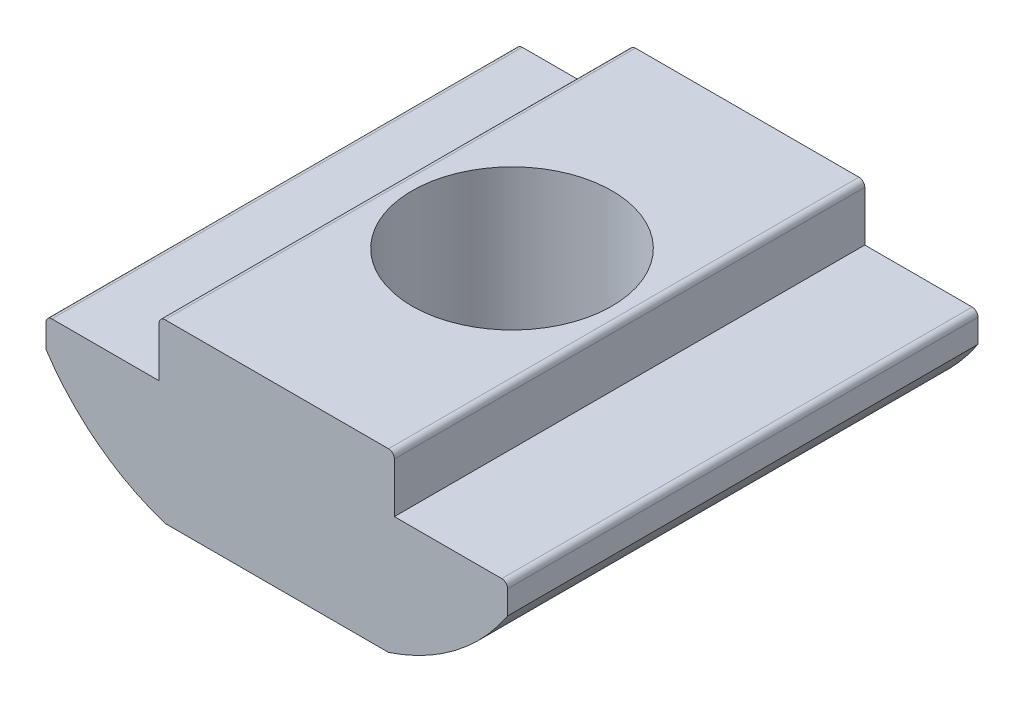
ISO-10303-21;
HEADER;
FILE_DESCRIPTION(('STEP AP214'),'2;1');
FILE_NAME('part.step','',(''),(''),'','','');
FILE_SCHEMA(('AUTOMOTIVE_DESIGN { 1 0 10303 214 1 1 1 1 }'));
ENDSEC;
DATA;
#1=APPLICATION_CONTEXT('core data for automotive mechanical design processes');
#2=APPLICATION_PROTOCOL_DEFINITION('international standard','automotive_design',2000,#1);
#3=PRODUCT_CONTEXT('',#1,'mechanical');
#4=PRODUCT('Part','Part','',(#3));
#5=PRODUCT_RELATED_PRODUCT_CATEGORY('part','',(#4));
#6=PRODUCT_DEFINITION_FORMATION('','',#4);
#7=PRODUCT_DEFINITION_CONTEXT('part definition',#1,'design');
#8=PRODUCT_DEFINITION('design','',#6,#7);
#9=PRODUCT_DEFINITION_SHAPE('','',#8);
#10=(LENGTH_UNIT() NAMED_UNIT(*) SI_UNIT(.MILLI.,.METRE.));
#11=(NAMED_UNIT(*) PLANE_ANGLE_UNIT() SI_UNIT($,.RADIAN.));
#12=(NAMED_UNIT(*) SI_UNIT($,.STERADIAN.) SOLID_ANGLE_UNIT());
#13=UNCERTAINTY_MEASURE_WITH_UNIT(LENGTH_MEASURE(1.E-05),#10,'distance_accuracy_value','');
#14=(GEOMETRIC_REPRESENTATION_CONTEXT(3) GLOBAL_UNCERTAINTY_ASSIGNED_CONTEXT((#13)) GLOBAL_UNIT_ASSIGNED_CONTEXT((#10,
#11,#12)) REPRESENTATION_CONTEXT('',''));
#15=CARTESIAN_POINT('',(0.,0.,0.));
#16=DIRECTION('',(0.,0.,1.));
#17=DIRECTION('',(1.,0.,0.));
#18=AXIS2_PLACEMENT_3D('',#15,#16,#17);
#19=CARTESIAN_POINT('',(1.37998996023953,7.35719053581624,8.));
#20=DIRECTION('',(0.,0.,-1.));
#21=DIRECTION('',(-1.,0.,0.));
#22=AXIS2_PLACEMENT_3D('',#19,#20,#21);
#23=CYLINDRICAL_SURFACE('',#22,7.74497909441023);
#24=CARTESIAN_POINT('',(1.37998996023953,7.35719053581624,-8.));
#25=DIRECTION('',(0.,0.,1.));
#26=DIRECTION('',(1.,0.,0.));
#27=AXIS2_PLACEMENT_3D('',#24,#25,#26);
#28=CIRCLE('',#27,7.74497909441023);
#29=CARTESIAN_POINT('',(3.80000000000109,0.,-8.));
#30=VERTEX_POINT('',#29);
#31=CARTESIAN_POINT('',(7.84999999999991,3.099999999999,-8.));
#32=VERTEX_POINT('',#31);
#33=EDGE_CURVE('E171',#30,#32,#28,.T.);
#34=ORIENTED_EDGE('',*,*,#33,.T.);
#35=DIRECTION('',(0.,0.,-1.));
#36=VECTOR('',#35,1.);
#37=CARTESIAN_POINT('',(7.84999999999991,3.099999999999,8.));
#38=LINE('',#37,#36);
#39=CARTESIAN_POINT('',(7.84999999999991,3.099999999999,8.));
#40=VERTEX_POINT('',#39);
#41=EDGE_CURVE('E11',#40,#32,#38,.T.);
#42=ORIENTED_EDGE('',*,*,#41,.F.);
#43=CARTESIAN_POINT('',(1.37998996023953,7.35719053581624,8.));
#44=DIRECTION('',(0.,0.,1.));
#45=DIRECTION('',(1.,0.,0.));
#46=AXIS2_PLACEMENT_3D('',#43,#44,#45);
#47=CIRCLE('',#46,7.74497909441023);
#48=CARTESIAN_POINT('',(3.80000000000109,0.,8.));
#49=VERTEX_POINT('',#48);
#50=EDGE_CURVE('E198',#49,#40,#47,.T.);
#51=ORIENTED_EDGE('',*,*,#50,.F.);
#52=DIRECTION('',(0.,0.,-1.));
#53=VECTOR('',#52,1.);
#54=CARTESIAN_POINT('',(3.80000000000109,0.,8.));
#55=LINE('',#54,#53);
#56=EDGE_CURVE('E167',#49,#30,#55,.T.);
#57=ORIENTED_EDGE('',*,*,#56,.T.);
#58=EDGE_LOOP('',(#34,#42,#51,#57));
#59=FACE_BOUND('',#58,.T.);
#60=ADVANCED_FACE('F39',(#59),#23,.T.);
#61=CARTESIAN_POINT('',(7.84999999999991,3.89999999999964,8.));
#62=DIRECTION('',(-1.,0.,0.));
#63=DIRECTION('',(0.,0.,1.));
#64=AXIS2_PLACEMENT_3D('',#61,#62,#63);
#65=PLANE('',#64);
#66=DIRECTION('',(0.,1.,0.));
#67=VECTOR('',#66,1.);
#68=CARTESIAN_POINT('',(7.84999999999991,3.89999999999964,-8.));
#69=LINE('',#68,#67);
#70=CARTESIAN_POINT('',(7.85000000000014,3.89999999999964,-8.));
#71=VERTEX_POINT('',#70);
#72=EDGE_CURVE('E174',#32,#71,#69,.T.);
#73=ORIENTED_EDGE('',*,*,#72,.T.);
#74=DIRECTION('',(0.,0.,-1.));
#75=VECTOR('',#74,1.);
#76=CARTESIAN_POINT('',(7.85000000000014,3.89999999999964,8.));
#77=LINE('',#76,#75);
#78=CARTESIAN_POINT('',(7.85000000000014,3.89999999999964,8.));
#79=VERTEX_POINT('',#78);
#80=EDGE_CURVE('E47',#79,#71,#77,.T.);
#81=ORIENTED_EDGE('',*,*,#80,.F.);
#82=DIRECTION('',(0.,1.,0.));
#83=VECTOR('',#82,1.);
#84=CARTESIAN_POINT('',(7.84999999999991,3.89999999999964,8.));
#85=LINE('',#84,#83);
#86=EDGE_CURVE('E116',#40,#79,#85,.T.);
#87=ORIENTED_EDGE('',*,*,#86,.F.);
#88=ORIENTED_EDGE('',*,*,#41,.T.);
#89=EDGE_LOOP('',(#73,#81,#87,#88));
#90=FACE_BOUND('',#89,.T.);
#91=ADVANCED_FACE('F288',(#90),#65,.F.);
#92=CARTESIAN_POINT('',(7.650000000001,3.90000000000009,8.));
#93=DIRECTION('',(0.,0.,-1.));
#94=DIRECTION('',(-1.,0.,0.));
#95=AXIS2_PLACEMENT_3D('',#92,#93,#94);
#96=CYLINDRICAL_SURFACE('',#95,0.199999999999136);
#97=CARTESIAN_POINT('',(7.650000000001,3.90000000000009,-8.));
#98=DIRECTION('',(0.,0.,1.));
#99=DIRECTION('',(1.,0.,0.));
#100=AXIS2_PLACEMENT_3D('',#97,#98,#99);
#101=CIRCLE('',#100,0.199999999999136);
#102=CARTESIAN_POINT('',(7.65000000000009,4.09999999999946,-8.));
#103=VERTEX_POINT('',#102);
#104=EDGE_CURVE('E177',#71,#103,#101,.T.);
#105=ORIENTED_EDGE('',*,*,#104,.T.);
#106=DIRECTION('',(0.,0.,-1.));
#107=VECTOR('',#106,1.);
#108=CARTESIAN_POINT('',(7.65000000000009,4.09999999999946,8.));
#109=LINE('',#108,#107);
#110=CARTESIAN_POINT('',(7.65000000000009,4.09999999999946,8.));
#111=VERTEX_POINT('',#110);
#112=EDGE_CURVE('E223',#111,#103,#109,.T.);
#113=ORIENTED_EDGE('',*,*,#112,.F.);
#114=CARTESIAN_POINT('',(7.650000000001,3.90000000000009,8.));
#115=DIRECTION('',(0.,0.,1.));
#116=DIRECTION('',(1.,0.,0.));
#117=AXIS2_PLACEMENT_3D('',#114,#115,#116);
#118=CIRCLE('',#117,0.199999999999136);
#119=EDGE_CURVE('E231',#79,#111,#118,.T.);
#120=ORIENTED_EDGE('',*,*,#119,.F.);
#121=ORIENTED_EDGE('',*,*,#80,.T.);
#122=EDGE_LOOP('',(#105,#113,#120,#121));
#123=FACE_BOUND('',#122,.T.);
#124=ADVANCED_FACE('F229',(#123),#96,.T.);
#125=CARTESIAN_POINT('',(3.99999999999955,4.09999999999946,8.));
#126=DIRECTION('',(0.,-1.,0.));
#127=DIRECTION('',(0.,0.,-1.));
#128=AXIS2_PLACEMENT_3D('',#125,#126,#127);
#129=PLANE('',#128);
#130=DIRECTION('',(-1.,0.,0.));
#131=VECTOR('',#130,1.);
#132=CARTESIAN_POINT('',(3.99999999999955,4.09999999999946,-8.));
#133=LINE('',#132,#131);
#134=CARTESIAN_POINT('',(3.99999999999955,4.09999999999946,-8.));
#135=VERTEX_POINT('',#134);
#136=EDGE_CURVE('E179',#103,#135,#133,.T.);
#137=ORIENTED_EDGE('',*,*,#136,.T.);
#138=DIRECTION('',(0.,0.,-1.));
#139=VECTOR('',#138,1.);
#140=CARTESIAN_POINT('',(3.99999999999955,4.09999999999946,8.));
#141=LINE('',#140,#139);
#142=CARTESIAN_POINT('',(3.99999999999955,4.09999999999946,8.));
#143=VERTEX_POINT('',#142);
#144=EDGE_CURVE('E220',#143,#135,#141,.T.);
#145=ORIENTED_EDGE('',*,*,#144,.F.);
#146=DIRECTION('',(-1.,0.,0.));
#147=VECTOR('',#146,1.);
#148=CARTESIAN_POINT('',(3.99999999999955,4.09999999999946,8.));
#149=LINE('',#148,#147);
#150=EDGE_CURVE('E249',#111,#143,#149,.T.);
#151=ORIENTED_EDGE('',*,*,#150,.F.);
#152=ORIENTED_EDGE('',*,*,#112,.T.);
#153=EDGE_LOOP('',(#137,#145,#151,#152));
#154=FACE_BOUND('',#153,.T.);
#155=ADVANCED_FACE('F240',(#154),#129,.F.);
#156=CARTESIAN_POINT('',(4.,5.79999999999973,8.));
#157=DIRECTION('',(-1.,2.67351500415206E-13,0.));
#158=DIRECTION('',(-2.67351500415206E-13,-1.,0.));
#159=AXIS2_PLACEMENT_3D('',#156,#157,#158);
#160=PLANE('',#159);
#161=DIRECTION('',(2.67351500415206E-13,1.,0.));
#162=VECTOR('',#161,1.);
#163=CARTESIAN_POINT('',(4.,5.79999999999973,-8.));
#164=LINE('',#163,#162);
#165=CARTESIAN_POINT('',(3.99999999999955,5.79999999999973,-8.));
#166=VERTEX_POINT('',#165);
#167=EDGE_CURVE('E181',#135,#166,#164,.T.);
#168=ORIENTED_EDGE('',*,*,#167,.T.);
#169=DIRECTION('',(0.,0.,-1.));
#170=VECTOR('',#169,1.);
#171=CARTESIAN_POINT('',(3.99999999999955,5.79999999999973,8.));
#172=LINE('',#171,#170);
#173=CARTESIAN_POINT('',(3.99999999999955,5.79999999999973,8.));
#174=VERTEX_POINT('',#173);
#175=EDGE_CURVE('E217',#174,#166,#172,.T.);
#176=ORIENTED_EDGE('',*,*,#175,.F.);
#177=DIRECTION('',(2.67351500415206E-13,1.,0.));
#178=VECTOR('',#177,1.);
#179=CARTESIAN_POINT('',(4.,5.79999999999973,8.));
#180=LINE('',#179,#178);
#181=EDGE_CURVE('E246',#143,#174,#180,.T.);
#182=ORIENTED_EDGE('',*,*,#181,.F.);
#183=ORIENTED_EDGE('',*,*,#144,.T.);
#184=EDGE_LOOP('',(#168,#176,#182,#183));
#185=FACE_BOUND('',#184,.T.);
#186=ADVANCED_FACE('F244',(#185),#160,.F.);
#187=CARTESIAN_POINT('',(3.79999999999882,5.79999999999927,8.));
#188=DIRECTION('',(0.,0.,-1.));
#189=DIRECTION('',(-1.,0.,0.));
#190=AXIS2_PLACEMENT_3D('',#187,#188,#189);
#191=CYLINDRICAL_SURFACE('',#190,0.200000000000728);
#192=CARTESIAN_POINT('',(3.79999999999882,5.79999999999927,-8.));
#193=DIRECTION('',(0.,0.,1.));
#194=DIRECTION('',(1.,0.,0.));
#195=AXIS2_PLACEMENT_3D('',#192,#193,#194);
#196=CIRCLE('',#195,0.200000000000728);
#197=CARTESIAN_POINT('',(3.80000000000018,5.99999999999955,-8.));
#198=VERTEX_POINT('',#197);
#199=EDGE_CURVE('E183',#166,#198,#196,.T.);
#200=ORIENTED_EDGE('',*,*,#199,.T.);
#201=DIRECTION('',(0.,0.,-1.));
#202=VECTOR('',#201,1.);
#203=CARTESIAN_POINT('',(3.80000000000018,5.99999999999955,8.));
#204=LINE('',#203,#202);
#205=CARTESIAN_POINT('',(3.80000000000018,5.99999999999955,8.));
#206=VERTEX_POINT('',#205);
#207=EDGE_CURVE('E214',#206,#198,#204,.T.);
#208=ORIENTED_EDGE('',*,*,#207,.F.);
#209=CARTESIAN_POINT('',(3.79999999999882,5.79999999999927,8.));
#210=DIRECTION('',(0.,0.,1.));
#211=DIRECTION('',(1.,0.,0.));
#212=AXIS2_PLACEMENT_3D('',#209,#210,#211);
#213=CIRCLE('',#212,0.200000000000728);
#214=EDGE_CURVE('E248',#174,#206,#213,.T.);
#215=ORIENTED_EDGE('',*,*,#214,.F.);
#216=ORIENTED_EDGE('',*,*,#175,.T.);
#217=EDGE_LOOP('',(#200,#208,#215,#216));
#218=FACE_BOUND('',#217,.T.);
#219=ADVANCED_FACE('F301',(#218),#191,.T.);
#220=CARTESIAN_POINT('',(-3.80000000000018,5.99999999999955,8.));
#221=DIRECTION('',(0.,-1.,0.));
#222=DIRECTION('',(0.,0.,-1.));
#223=AXIS2_PLACEMENT_3D('',#220,#221,#222);
#224=PLANE('',#223);
#225=CARTESIAN_POINT('',(0.,5.99999999999955,0.));
#226=DIRECTION('',(0.,1.,0.));
#227=DIRECTION('',(0.,0.,1.));
#228=AXIS2_PLACEMENT_3D('',#225,#226,#227);
#229=CIRCLE('',#228,3.39999999999999);
#230=CARTESIAN_POINT('',(0.,5.99999999999955,3.39999999999999));
#231=VERTEX_POINT('',#230);
#232=EDGE_CURVE('E374',#231,#231,#229,.T.);
#233=ORIENTED_EDGE('',*,*,#232,.F.);
#234=EDGE_LOOP('',(#233));
#235=FACE_BOUND('',#234,.T.);
#236=DIRECTION('',(-1.,0.,0.));
#237=VECTOR('',#236,1.);
#238=CARTESIAN_POINT('',(-3.80000000000018,5.99999999999955,-8.));
#239=LINE('',#238,#237);
#240=CARTESIAN_POINT('',(-3.80000000000018,5.99999999999955,-8.));
#241=VERTEX_POINT('',#240);
#242=EDGE_CURVE('E185',#198,#241,#239,.T.);
#243=ORIENTED_EDGE('',*,*,#242,.T.);
#244=DIRECTION('',(0.,0.,-1.));
#245=VECTOR('',#244,1.);
#246=CARTESIAN_POINT('',(-3.80000000000018,5.99999999999955,8.));
#247=LINE('',#246,#245);
#248=CARTESIAN_POINT('',(-3.80000000000018,5.99999999999955,8.));
#249=VERTEX_POINT('',#248);
#250=EDGE_CURVE('E211',#249,#241,#247,.T.);
#251=ORIENTED_EDGE('',*,*,#250,.F.);
#252=DIRECTION('',(-1.,0.,0.));
#253=VECTOR('',#252,1.);
#254=CARTESIAN_POINT('',(-3.80000000000018,5.99999999999955,8.));
#255=LINE('',#254,#253);
#256=EDGE_CURVE('E251',#206,#249,#255,.T.);
#257=ORIENTED_EDGE('',*,*,#256,.F.);
#258=ORIENTED_EDGE('',*,*,#207,.T.);
#259=EDGE_LOOP('',(#243,#251,#257,#258));
#260=FACE_BOUND('',#259,.T.);
#261=ADVANCED_FACE('F304',(#235,#260),#224,.F.);
#262=CARTESIAN_POINT('',(-3.79999999999927,5.79999999999882,8.));
#263=DIRECTION('',(0.,0.,-1.));
#264=DIRECTION('',(-1.,0.,0.));
#265=AXIS2_PLACEMENT_3D('',#262,#263,#264);
#266=CYLINDRICAL_SURFACE('',#265,0.200000000000728);
#267=CARTESIAN_POINT('',(-3.79999999999927,5.79999999999882,-8.));
#268=DIRECTION('',(0.,0.,1.));
#269=DIRECTION('',(1.,0.,0.));
#270=AXIS2_PLACEMENT_3D('',#267,#268,#269);
#271=CIRCLE('',#270,0.200000000000728);
#272=CARTESIAN_POINT('',(-4.,5.79999999999973,-8.));
#273=VERTEX_POINT('',#272);
#274=EDGE_CURVE('E187',#241,#273,#271,.T.);
#275=ORIENTED_EDGE('',*,*,#274,.T.);
#276=DIRECTION('',(0.,0.,-1.));
#277=VECTOR('',#276,1.);
#278=CARTESIAN_POINT('',(-4.,5.79999999999973,8.));
#279=LINE('',#278,#277);
#280=CARTESIAN_POINT('',(-4.,5.79999999999973,8.));
#281=VERTEX_POINT('',#280);
#282=EDGE_CURVE('E208',#281,#273,#279,.T.);
#283=ORIENTED_EDGE('',*,*,#282,.F.);
#284=CARTESIAN_POINT('',(-3.79999999999927,5.79999999999882,8.));
#285=DIRECTION('',(0.,0.,1.));
#286=DIRECTION('',(1.,0.,0.));
#287=AXIS2_PLACEMENT_3D('',#284,#285,#286);
#288=CIRCLE('',#287,0.200000000000728);
#289=EDGE_CURVE('E257',#249,#281,#288,.T.);
#290=ORIENTED_EDGE('',*,*,#289,.F.);
#291=ORIENTED_EDGE('',*,*,#250,.T.);
#292=EDGE_LOOP('',(#275,#283,#290,#291));
#293=FACE_BOUND('',#292,.T.);
#294=ADVANCED_FACE('F308',(#293),#266,.T.);
#295=CARTESIAN_POINT('',(-4.,5.79999999999973,8.));
#296=DIRECTION('',(1.,-2.67351500415206E-13,0.));
#297=DIRECTION('',(2.67351500415206E-13,1.,0.));
#298=AXIS2_PLACEMENT_3D('',#295,#296,#297);
#299=PLANE('',#298);
#300=DIRECTION('',(-2.67351500415206E-13,-1.,0.));
#301=VECTOR('',#300,1.);
#302=CARTESIAN_POINT('',(-4.,5.79999999999973,-8.));
#303=LINE('',#302,#301);
#304=CARTESIAN_POINT('',(-4.00000000000045,4.09999999999946,-8.));
#305=VERTEX_POINT('',#304);
#306=EDGE_CURVE('E189',#273,#305,#303,.T.);
#307=ORIENTED_EDGE('',*,*,#306,.T.);
#308=DIRECTION('',(0.,0.,-1.));
#309=VECTOR('',#308,1.);
#310=CARTESIAN_POINT('',(-4.00000000000045,4.09999999999946,8.));
#311=LINE('',#310,#309);
#312=CARTESIAN_POINT('',(-4.00000000000045,4.09999999999946,8.));
#313=VERTEX_POINT('',#312);
#314=EDGE_CURVE('E205',#313,#305,#311,.T.);
#315=ORIENTED_EDGE('',*,*,#314,.F.);
#316=DIRECTION('',(-2.67351500415206E-13,-1.,0.));
#317=VECTOR('',#316,1.);
#318=CARTESIAN_POINT('',(-4.,5.79999999999973,8.));
#319=LINE('',#318,#317);
#320=EDGE_CURVE('E259',#281,#313,#319,.T.);
#321=ORIENTED_EDGE('',*,*,#320,.F.);
#322=ORIENTED_EDGE('',*,*,#282,.T.);
#323=EDGE_LOOP('',(#307,#315,#321,#322));
#324=FACE_BOUND('',#323,.T.);
#325=ADVANCED_FACE('F312',(#324),#299,.F.);
#326=CARTESIAN_POINT('',(-7.65000000000009,4.09999999999946,8.));
#327=DIRECTION('',(0.,-1.,0.));
#328=DIRECTION('',(0.,0.,-1.));
#329=AXIS2_PLACEMENT_3D('',#326,#327,#328);
#330=PLANE('',#329);
#331=DIRECTION('',(-1.,0.,0.));
#332=VECTOR('',#331,1.);
#333=CARTESIAN_POINT('',(-7.65000000000009,4.09999999999946,-8.));
#334=LINE('',#333,#332);
#335=CARTESIAN_POINT('',(-7.65000000000009,4.09999999999946,-8.));
#336=VERTEX_POINT('',#335);
#337=EDGE_CURVE('E191',#305,#336,#334,.T.);
#338=ORIENTED_EDGE('',*,*,#337,.T.);
#339=DIRECTION('',(0.,0.,-1.));
#340=VECTOR('',#339,1.);
#341=CARTESIAN_POINT('',(-7.65000000000009,4.09999999999946,8.));
#342=LINE('',#341,#340);
#343=CARTESIAN_POINT('',(-7.65000000000009,4.09999999999946,8.));
#344=VERTEX_POINT('',#343);
#345=EDGE_CURVE('E202',#344,#336,#342,.T.);
#346=ORIENTED_EDGE('',*,*,#345,.F.);
#347=DIRECTION('',(-1.,0.,0.));
#348=VECTOR('',#347,1.);
#349=CARTESIAN_POINT('',(-7.65000000000009,4.09999999999946,8.));
#350=LINE('',#349,#348);
#351=EDGE_CURVE('E261',#313,#344,#350,.T.);
#352=ORIENTED_EDGE('',*,*,#351,.F.);
#353=ORIENTED_EDGE('',*,*,#314,.T.);
#354=EDGE_LOOP('',(#338,#346,#352,#353));
#355=FACE_BOUND('',#354,.T.);
#356=ADVANCED_FACE('F267',(#355),#330,.F.);
#357=CARTESIAN_POINT('',(-7.65000000000055,3.90000000000009,8.));
#358=DIRECTION('',(0.,0.,-1.));
#359=DIRECTION('',(-1.,0.,0.));
#360=AXIS2_PLACEMENT_3D('',#357,#358,#359);
#361=CYLINDRICAL_SURFACE('',#360,0.199999999999363);
#362=CARTESIAN_POINT('',(-7.65000000000055,3.90000000000009,-8.));
#363=DIRECTION('',(0.,0.,1.));
#364=DIRECTION('',(1.,0.,0.));
#365=AXIS2_PLACEMENT_3D('',#362,#363,#364);
#366=CIRCLE('',#365,0.199999999999363);
#367=CARTESIAN_POINT('',(-7.84999999999991,3.89999999999964,-8.));
#368=VERTEX_POINT('',#367);
#369=EDGE_CURVE('E193',#336,#368,#366,.T.);
#370=ORIENTED_EDGE('',*,*,#369,.T.);
#371=DIRECTION('',(0.,0.,-1.));
#372=VECTOR('',#371,1.);
#373=CARTESIAN_POINT('',(-7.84999999999991,3.89999999999964,8.));
#374=LINE('',#373,#372);
#375=CARTESIAN_POINT('',(-7.84999999999991,3.89999999999964,8.));
#376=VERTEX_POINT('',#375);
#377=EDGE_CURVE('E162',#376,#368,#374,.T.);
#378=ORIENTED_EDGE('',*,*,#377,.F.);
#379=CARTESIAN_POINT('',(-7.65000000000055,3.90000000000009,8.));
#380=DIRECTION('',(0.,0.,1.));
#381=DIRECTION('',(1.,0.,0.));
#382=AXIS2_PLACEMENT_3D('',#379,#380,#381);
#383=CIRCLE('',#382,0.199999999999363);
#384=EDGE_CURVE('E153',#344,#376,#383,.T.);
#385=ORIENTED_EDGE('',*,*,#384,.F.);
#386=ORIENTED_EDGE('',*,*,#345,.T.);
#387=EDGE_LOOP('',(#370,#378,#385,#386));
#388=FACE_BOUND('',#387,.T.);
#389=ADVANCED_FACE('F271',(#388),#361,.T.);
#390=CARTESIAN_POINT('',(-7.84999999999991,3.89999999999964,8.));
#391=DIRECTION('',(1.,0.,0.));
#392=DIRECTION('',(0.,0.,-1.));
#393=AXIS2_PLACEMENT_3D('',#390,#391,#392);
#394=PLANE('',#393);
#395=DIRECTION('',(0.,-1.,0.));
#396=VECTOR('',#395,1.);
#397=CARTESIAN_POINT('',(-7.84999999999991,3.89999999999964,-8.));
#398=LINE('',#397,#396);
#399=CARTESIAN_POINT('',(-7.84999999999988,3.09999999999902,-8.));
#400=VERTEX_POINT('',#399);
#401=EDGE_CURVE('E161',#368,#400,#398,.T.);
#402=ORIENTED_EDGE('',*,*,#401,.T.);
#403=DIRECTION('',(0.,0.,-1.));
#404=VECTOR('',#403,1.);
#405=CARTESIAN_POINT('',(-7.84999999999988,3.09999999999902,8.));
#406=LINE('',#405,#404);
#407=CARTESIAN_POINT('',(-7.84999999999988,3.09999999999902,8.));
#408=VERTEX_POINT('',#407);
#409=EDGE_CURVE('E158',#408,#400,#406,.T.);
#410=ORIENTED_EDGE('',*,*,#409,.F.);
#411=DIRECTION('',(0.,-1.,0.));
#412=VECTOR('',#411,1.);
#413=CARTESIAN_POINT('',(-7.84999999999991,3.89999999999964,8.));
#414=LINE('',#413,#412);
#415=EDGE_CURVE('E147',#376,#408,#414,.T.);
#416=ORIENTED_EDGE('',*,*,#415,.F.);
#417=ORIENTED_EDGE('',*,*,#377,.T.);
#418=EDGE_LOOP('',(#402,#410,#416,#417));
#419=FACE_BOUND('',#418,.T.);
#420=ADVANCED_FACE('F159',(#419),#394,.F.);
#421=CARTESIAN_POINT('',(-1.37998996023953,7.35719053581624,8.));
#422=DIRECTION('',(0.,0.,-1.));
#423=DIRECTION('',(-1.,0.,0.));
#424=AXIS2_PLACEMENT_3D('',#421,#422,#423);
#425=CYLINDRICAL_SURFACE('',#424,7.74497909441023);
#426=CARTESIAN_POINT('',(-1.37998996023953,7.35719053581624,-8.));
#427=DIRECTION('',(0.,0.,1.));
#428=DIRECTION('',(1.,0.,0.));
#429=AXIS2_PLACEMENT_3D('',#426,#427,#428);
#430=CIRCLE('',#429,7.74497909441023);
#431=CARTESIAN_POINT('',(-3.80000000000109,0.,-8.));
#432=VERTEX_POINT('',#431);
#433=EDGE_CURVE('E102',#400,#432,#430,.T.);
#434=ORIENTED_EDGE('',*,*,#433,.T.);
#435=DIRECTION('',(0.,0.,-1.));
#436=VECTOR('',#435,1.);
#437=CARTESIAN_POINT('',(-3.80000000000109,0.,8.));
#438=LINE('',#437,#436);
#439=CARTESIAN_POINT('',(-3.80000000000109,0.,8.));
#440=VERTEX_POINT('',#439);
#441=EDGE_CURVE('E163',#440,#432,#438,.T.);
#442=ORIENTED_EDGE('',*,*,#441,.F.);
#443=CARTESIAN_POINT('',(-1.37998996023953,7.35719053581624,8.));
#444=DIRECTION('',(0.,0.,1.));
#445=DIRECTION('',(1.,0.,0.));
#446=AXIS2_PLACEMENT_3D('',#443,#444,#445);
#447=CIRCLE('',#446,7.74497909441023);
#448=EDGE_CURVE('E151',#408,#440,#447,.T.);
#449=ORIENTED_EDGE('',*,*,#448,.F.);
#450=ORIENTED_EDGE('',*,*,#409,.T.);
#451=EDGE_LOOP('',(#434,#442,#449,#450));
#452=FACE_BOUND('',#451,.T.);
#453=ADVANCED_FACE('F165',(#452),#425,.T.);
#454=CARTESIAN_POINT('',(3.80000000000109,0.,8.));
#455=DIRECTION('',(0.,1.,0.));
#456=DIRECTION('',(0.,0.,1.));
#457=AXIS2_PLACEMENT_3D('',#454,#455,#456);
#458=PLANE('',#457);
#459=CARTESIAN_POINT('',(0.,0.,0.));
#460=DIRECTION('',(0.,1.,0.));
#461=DIRECTION('',(0.,0.,1.));
#462=AXIS2_PLACEMENT_3D('',#459,#460,#461);
#463=CIRCLE('',#462,3.39999999999999);
#464=CARTESIAN_POINT('',(0.,0.,3.39999999999999));
#465=VERTEX_POINT('',#464);
#466=EDGE_CURVE('E175',#465,#465,#463,.T.);
#467=ORIENTED_EDGE('',*,*,#466,.T.);
#468=EDGE_LOOP('',(#467));
#469=FACE_BOUND('',#468,.T.);
#470=DIRECTION('',(1.,0.,0.));
#471=VECTOR('',#470,1.);
#472=CARTESIAN_POINT('',(3.80000000000109,0.,-8.));
#473=LINE('',#472,#471);
#474=EDGE_CURVE('E108',#432,#30,#473,.T.);
#475=ORIENTED_EDGE('',*,*,#474,.T.);
#476=ORIENTED_EDGE('',*,*,#56,.F.);
#477=DIRECTION('',(1.,0.,0.));
#478=VECTOR('',#477,1.);
#479=CARTESIAN_POINT('',(3.80000000000109,0.,8.));
#480=LINE('',#479,#478);
#481=EDGE_CURVE('E55',#440,#49,#480,.T.);
#482=ORIENTED_EDGE('',*,*,#481,.F.);
#483=ORIENTED_EDGE('',*,*,#441,.T.);
#484=EDGE_LOOP('',(#475,#476,#482,#483));
#485=FACE_BOUND('',#484,.T.);
#486=ADVANCED_FACE('F275',(#469,#485),#458,.F.);
#487=CARTESIAN_POINT('',(1.37998996023953,7.35719053581624,8.));
#488=DIRECTION('',(0.,0.,1.));
#489=DIRECTION('',(1.,0.,0.));
#490=AXIS2_PLACEMENT_3D('',#487,#488,#489);
#491=PLANE('',#490);
#492=ORIENTED_EDGE('',*,*,#50,.T.);
#493=ORIENTED_EDGE('',*,*,#86,.T.);
#494=ORIENTED_EDGE('',*,*,#119,.T.);
#495=ORIENTED_EDGE('',*,*,#150,.T.);
#496=ORIENTED_EDGE('',*,*,#181,.T.);
#497=ORIENTED_EDGE('',*,*,#214,.T.);
#498=ORIENTED_EDGE('',*,*,#256,.T.);
#499=ORIENTED_EDGE('',*,*,#289,.T.);
#500=ORIENTED_EDGE('',*,*,#320,.T.);
#501=ORIENTED_EDGE('',*,*,#351,.T.);
#502=ORIENTED_EDGE('',*,*,#384,.T.);
#503=ORIENTED_EDGE('',*,*,#415,.T.);
#504=ORIENTED_EDGE('',*,*,#448,.T.);
#505=ORIENTED_EDGE('',*,*,#481,.T.);
#506=EDGE_LOOP('',(#492,#493,#494,#495,#496,#497,#498,#499,#500,#501,#502,#503,#504,#505));
#507=FACE_BOUND('',#506,.T.);
#508=ADVANCED_FACE('F149',(#507),#491,.T.);
#509=CARTESIAN_POINT('',(1.37998996023953,7.35719053581624,-8.));
#510=DIRECTION('',(0.,0.,1.));
#511=DIRECTION('',(1.,0.,0.));
#512=AXIS2_PLACEMENT_3D('',#509,#510,#511);
#513=PLANE('',#512);
#514=ORIENTED_EDGE('',*,*,#33,.F.);
#515=ORIENTED_EDGE('',*,*,#474,.F.);
#516=ORIENTED_EDGE('',*,*,#433,.F.);
#517=ORIENTED_EDGE('',*,*,#401,.F.);
#518=ORIENTED_EDGE('',*,*,#369,.F.);
#519=ORIENTED_EDGE('',*,*,#337,.F.);
#520=ORIENTED_EDGE('',*,*,#306,.F.);
#521=ORIENTED_EDGE('',*,*,#274,.F.);
#522=ORIENTED_EDGE('',*,*,#242,.F.);
#523=ORIENTED_EDGE('',*,*,#199,.F.);
#524=ORIENTED_EDGE('',*,*,#167,.F.);
#525=ORIENTED_EDGE('',*,*,#136,.F.);
#526=ORIENTED_EDGE('',*,*,#104,.F.);
#527=ORIENTED_EDGE('',*,*,#72,.F.);
#528=EDGE_LOOP('',(#514,#515,#516,#517,#518,#519,#520,#521,#522,#523,#524,#525,#526,#527));
#529=FACE_BOUND('',#528,.T.);
#530=ADVANCED_FACE('F235',(#529),#513,.F.);
#531=CARTESIAN_POINT('',(0.,5.99999999999955,0.));
#532=DIRECTION('',(0.,1.,0.));
#533=DIRECTION('',(0.,0.,1.));
#534=AXIS2_PLACEMENT_3D('',#531,#532,#533);
#535=CYLINDRICAL_SURFACE('',#534,3.39999999999999);
#536=ORIENTED_EDGE('',*,*,#232,.T.);
#537=EDGE_LOOP('',(#536));
#538=FACE_BOUND('',#537,.T.);
#539=ORIENTED_EDGE('',*,*,#466,.F.);
#540=EDGE_LOOP('',(#539));
#541=FACE_BOUND('',#540,.T.);
#542=ADVANCED_FACE('F346',(#538,#541),#535,.F.);
#543=CLOSED_SHELL('',(#60,#91,#124,#155,#186,#219,#261,#294,#325,#356,#389,#420,#453,#486,#508,
#530,#542));
#544=MANIFOLD_SOLID_BREP('B2',#543);
#545=ADVANCED_BREP_SHAPE_REPRESENTATION('',(#18,#544),#14);
#546=SHAPE_DEFINITION_REPRESENTATION(#9,#545);
ENDSEC;
END-ISO-10303-21;
